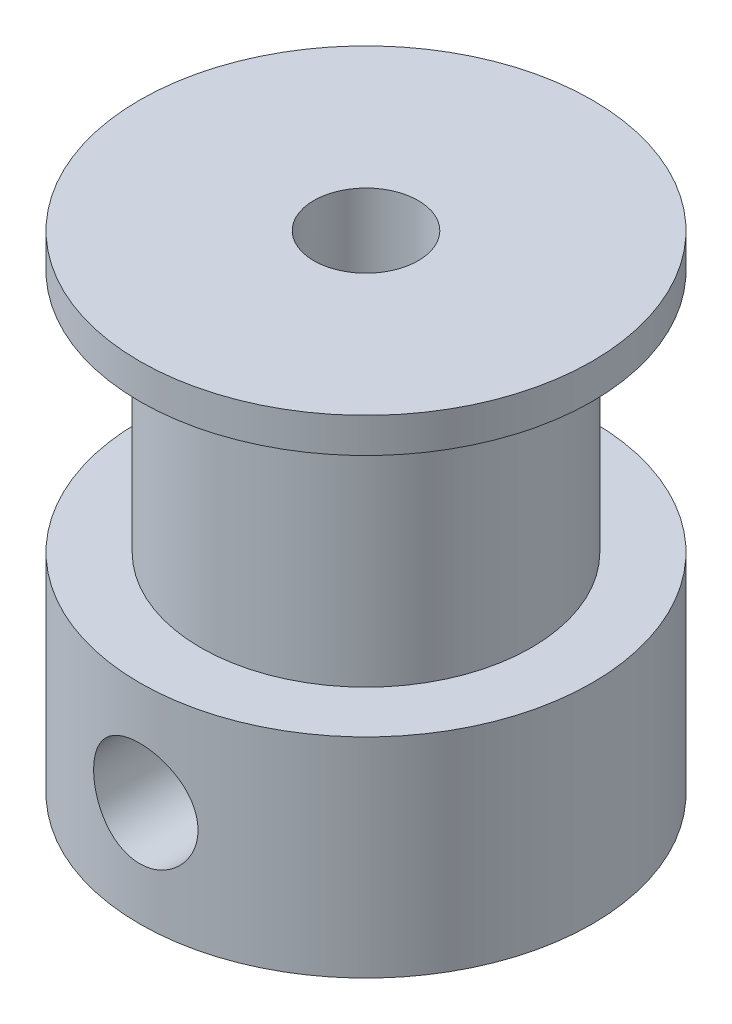
ISO-10303-21;
HEADER;
FILE_DESCRIPTION(('STEP AP214'),'2;1');
FILE_NAME('part.step','',(''),(''),'','','');
FILE_SCHEMA(('AUTOMOTIVE_DESIGN { 1 0 10303 214 1 1 1 1 }'));
ENDSEC;
DATA;
#1=APPLICATION_CONTEXT('core data for automotive mechanical design processes');
#2=APPLICATION_PROTOCOL_DEFINITION('international standard','automotive_design',2000,#1);
#3=PRODUCT_CONTEXT('',#1,'mechanical');
#4=PRODUCT('Part','Part','',(#3));
#5=PRODUCT_RELATED_PRODUCT_CATEGORY('part','',(#4));
#6=PRODUCT_DEFINITION_FORMATION('','',#4);
#7=PRODUCT_DEFINITION_CONTEXT('part definition',#1,'design');
#8=PRODUCT_DEFINITION('design','',#6,#7);
#9=PRODUCT_DEFINITION_SHAPE('','',#8);
#10=(LENGTH_UNIT() NAMED_UNIT(*) SI_UNIT(.MILLI.,.METRE.));
#11=(NAMED_UNIT(*) PLANE_ANGLE_UNIT() SI_UNIT($,.RADIAN.));
#12=(NAMED_UNIT(*) SI_UNIT($,.STERADIAN.) SOLID_ANGLE_UNIT());
#13=UNCERTAINTY_MEASURE_WITH_UNIT(LENGTH_MEASURE(1.E-05),#10,'distance_accuracy_value','');
#14=(GEOMETRIC_REPRESENTATION_CONTEXT(3) GLOBAL_UNCERTAINTY_ASSIGNED_CONTEXT((#13)) GLOBAL_UNIT_ASSIGNED_CONTEXT((#10,
#11,#12)) REPRESENTATION_CONTEXT('',''));
#15=CARTESIAN_POINT('',(0.,0.,0.));
#16=DIRECTION('',(0.,0.,1.));
#17=DIRECTION('',(1.,0.,0.));
#18=AXIS2_PLACEMENT_3D('',#15,#16,#17);
#19=CARTESIAN_POINT('',(0.,66.,0.));
#20=DIRECTION('',(0.,1.,0.));
#21=DIRECTION('',(0.,0.,1.));
#22=AXIS2_PLACEMENT_3D('',#19,#20,#21);
#23=CYLINDRICAL_SURFACE('',#22,1.5);
#24=CARTESIAN_POINT('',(0.,3.,0.));
#25=DIRECTION('',(0.,-0.707106781186547,0.707106781186547));
#26=DIRECTION('',(0.,0.707106781186547,0.707106781186547));
#27=AXIS2_PLACEMENT_3D('',#24,#25,#26);
#28=ELLIPSE('',#27,2.12132034355964,1.5);
#29=CARTESIAN_POINT('',(-1.5,3.,0.));
#30=VERTEX_POINT('',#29);
#31=CARTESIAN_POINT('',(1.5,3.,0.));
#32=VERTEX_POINT('',#31);
#33=EDGE_CURVE('E51',#30,#32,#28,.F.);
#34=ORIENTED_EDGE('',*,*,#33,.F.);
#35=CARTESIAN_POINT('',(0.,3.,0.));
#36=DIRECTION('',(0.,0.707106781186547,0.707106781186547));
#37=DIRECTION('',(0.,-0.707106781186547,0.707106781186547));
#38=AXIS2_PLACEMENT_3D('',#35,#36,#37);
#39=ELLIPSE('',#38,2.12132034355964,1.5);
#40=EDGE_CURVE('E49',#32,#30,#39,.F.);
#41=ORIENTED_EDGE('',*,*,#40,.F.);
#42=EDGE_LOOP('',(#34,#41));
#43=FACE_BOUND('',#42,.T.);
#44=CARTESIAN_POINT('',(0.,0.,0.));
#45=DIRECTION('',(0.,1.,0.));
#46=DIRECTION('',(0.,0.,1.));
#47=AXIS2_PLACEMENT_3D('',#44,#45,#46);
#48=CIRCLE('',#47,1.5);
#49=CARTESIAN_POINT('',(0.,0.,1.5));
#50=VERTEX_POINT('',#49);
#51=EDGE_CURVE('E57',#50,#50,#48,.T.);
#52=ORIENTED_EDGE('',*,*,#51,.F.);
#53=EDGE_LOOP('',(#52));
#54=FACE_BOUND('',#53,.T.);
#55=CARTESIAN_POINT('',(0.,14.,0.));
#56=DIRECTION('',(0.,1.,0.));
#57=DIRECTION('',(0.,0.,1.));
#58=AXIS2_PLACEMENT_3D('',#55,#56,#57);
#59=CIRCLE('',#58,1.5);
#60=CARTESIAN_POINT('',(0.,14.,1.5));
#61=VERTEX_POINT('',#60);
#62=EDGE_CURVE('E11',#61,#61,#59,.T.);
#63=ORIENTED_EDGE('',*,*,#62,.T.);
#64=EDGE_LOOP('',(#63));
#65=FACE_BOUND('',#64,.T.);
#66=ADVANCED_FACE('F36',(#43,#54,#65),#23,.F.);
#67=CARTESIAN_POINT('',(1.5,14.,0.));
#68=DIRECTION('',(0.,-1.,0.));
#69=DIRECTION('',(0.,0.,-1.));
#70=AXIS2_PLACEMENT_3D('',#67,#68,#69);
#71=PLANE('',#70);
#72=ORIENTED_EDGE('',*,*,#62,.F.);
#73=EDGE_LOOP('',(#72));
#74=FACE_BOUND('',#73,.T.);
#75=CARTESIAN_POINT('',(0.,14.,0.));
#76=DIRECTION('',(0.,1.,0.));
#77=DIRECTION('',(0.,0.,1.));
#78=AXIS2_PLACEMENT_3D('',#75,#76,#77);
#79=CIRCLE('',#78,6.5);
#80=CARTESIAN_POINT('',(0.,14.,6.5));
#81=VERTEX_POINT('',#80);
#82=EDGE_CURVE('E43',#81,#81,#79,.T.);
#83=ORIENTED_EDGE('',*,*,#82,.T.);
#84=EDGE_LOOP('',(#83));
#85=FACE_BOUND('',#84,.T.);
#86=ADVANCED_FACE('F97',(#74,#85),#71,.F.);
#87=CARTESIAN_POINT('',(0.,66.,0.));
#88=DIRECTION('',(0.,1.,0.));
#89=DIRECTION('',(0.,0.,1.));
#90=AXIS2_PLACEMENT_3D('',#87,#88,#89);
#91=CYLINDRICAL_SURFACE('',#90,6.5);
#92=ORIENTED_EDGE('',*,*,#82,.F.);
#93=EDGE_LOOP('',(#92));
#94=FACE_BOUND('',#93,.T.);
#95=CARTESIAN_POINT('',(0.,13.,0.));
#96=DIRECTION('',(0.,1.,0.));
#97=DIRECTION('',(0.,0.,1.));
#98=AXIS2_PLACEMENT_3D('',#95,#96,#97);
#99=CIRCLE('',#98,6.5);
#100=CARTESIAN_POINT('',(0.,13.,6.5));
#101=VERTEX_POINT('',#100);
#102=EDGE_CURVE('E108',#101,#101,#99,.T.);
#103=ORIENTED_EDGE('',*,*,#102,.T.);
#104=EDGE_LOOP('',(#103));
#105=FACE_BOUND('',#104,.T.);
#106=ADVANCED_FACE('F94',(#94,#105),#91,.T.);
#107=CARTESIAN_POINT('',(6.5,13.,0.));
#108=DIRECTION('',(0.,1.,0.));
#109=DIRECTION('',(0.,0.,1.));
#110=AXIS2_PLACEMENT_3D('',#107,#108,#109);
#111=PLANE('',#110);
#112=ORIENTED_EDGE('',*,*,#102,.F.);
#113=EDGE_LOOP('',(#112));
#114=FACE_BOUND('',#113,.T.);
#115=CARTESIAN_POINT('',(0.,13.,0.));
#116=DIRECTION('',(0.,1.,0.));
#117=DIRECTION('',(0.,0.,1.));
#118=AXIS2_PLACEMENT_3D('',#115,#116,#117);
#119=CIRCLE('',#118,4.75);
#120=CARTESIAN_POINT('',(0.,13.,4.75));
#121=VERTEX_POINT('',#120);
#122=EDGE_CURVE('E110',#121,#121,#119,.T.);
#123=ORIENTED_EDGE('',*,*,#122,.T.);
#124=EDGE_LOOP('',(#123));
#125=FACE_BOUND('',#124,.T.);
#126=ADVANCED_FACE('F90',(#114,#125),#111,.F.);
#127=CARTESIAN_POINT('',(0.,66.,0.));
#128=DIRECTION('',(0.,1.,0.));
#129=DIRECTION('',(0.,0.,1.));
#130=AXIS2_PLACEMENT_3D('',#127,#128,#129);
#131=CYLINDRICAL_SURFACE('',#130,4.75);
#132=ORIENTED_EDGE('',*,*,#122,.F.);
#133=EDGE_LOOP('',(#132));
#134=FACE_BOUND('',#133,.T.);
#135=CARTESIAN_POINT('',(0.,6.,0.));
#136=DIRECTION('',(0.,1.,0.));
#137=DIRECTION('',(0.,0.,1.));
#138=AXIS2_PLACEMENT_3D('',#135,#136,#137);
#139=CIRCLE('',#138,4.75);
#140=CARTESIAN_POINT('',(0.,6.,4.75));
#141=VERTEX_POINT('',#140);
#142=EDGE_CURVE('E115',#141,#141,#139,.T.);
#143=ORIENTED_EDGE('',*,*,#142,.T.);
#144=EDGE_LOOP('',(#143));
#145=FACE_BOUND('',#144,.T.);
#146=ADVANCED_FACE('F86',(#134,#145),#131,.T.);
#147=CARTESIAN_POINT('',(4.75,6.,0.));
#148=DIRECTION('',(0.,-1.,0.));
#149=DIRECTION('',(0.,0.,-1.));
#150=AXIS2_PLACEMENT_3D('',#147,#148,#149);
#151=PLANE('',#150);
#152=ORIENTED_EDGE('',*,*,#142,.F.);
#153=EDGE_LOOP('',(#152));
#154=FACE_BOUND('',#153,.T.);
#155=CARTESIAN_POINT('',(0.,6.,0.));
#156=DIRECTION('',(0.,1.,0.));
#157=DIRECTION('',(0.,0.,1.));
#158=AXIS2_PLACEMENT_3D('',#155,#156,#157);
#159=CIRCLE('',#158,6.5);
#160=CARTESIAN_POINT('',(0.,6.,6.5));
#161=VERTEX_POINT('',#160);
#162=EDGE_CURVE('E118',#161,#161,#159,.T.);
#163=ORIENTED_EDGE('',*,*,#162,.T.);
#164=EDGE_LOOP('',(#163));
#165=FACE_BOUND('',#164,.T.);
#166=ADVANCED_FACE('F82',(#154,#165),#151,.F.);
#167=CARTESIAN_POINT('',(0.,66.,0.));
#168=DIRECTION('',(0.,1.,0.));
#169=DIRECTION('',(0.,0.,1.));
#170=AXIS2_PLACEMENT_3D('',#167,#168,#169);
#171=CYLINDRICAL_SURFACE('',#170,6.5);
#172=CARTESIAN_POINT('',(1.5,3.,6.32455532033676));
#173=CARTESIAN_POINT('',(1.49999731225034,3.08304296481457,6.3245569864533));
#174=CARTESIAN_POINT('',(1.49308039515328,3.16611724021881,6.32620871498674));
#175=CARTESIAN_POINT('',(1.46563082834671,3.32989476208439,6.33262329615483));
#176=CARTESIAN_POINT('',(1.44508905111762,3.41059638118947,6.33738823434819));
#177=CARTESIAN_POINT('',(1.39107808122442,3.56723591928032,6.34946149326292));
#178=CARTESIAN_POINT('',(1.3576239938208,3.64317928442072,6.35676684114118));
#179=CARTESIAN_POINT('',(1.27878238190571,3.78837980344436,6.37309417235741));
#180=CARTESIAN_POINT('',(1.23339482024643,3.85763693651305,6.3821161610391));
#181=CARTESIAN_POINT('',(1.13106531351183,3.9888002271969,6.40104967504166));
#182=CARTESIAN_POINT('',(1.0739411222239,4.05056243056122,6.41097365327686));
#183=CARTESIAN_POINT('',(0.950153022384888,4.16371914455152,6.43048432059803));
#184=CARTESIAN_POINT('',(0.88348831975836,4.21511279132336,6.44007098152559));
#185=CARTESIAN_POINT('',(0.74153852579874,4.30665022045213,6.45796329743802));
#186=CARTESIAN_POINT('',(0.666161188886942,4.3466544388693,6.46625254288521));
#187=CARTESIAN_POINT('',(0.509529827009773,4.41337285008016,6.4804748675058));
#188=CARTESIAN_POINT('',(0.42827653913144,4.44008870648269,6.48640824159883));
#189=CARTESIAN_POINT('',(0.263698138287239,4.47901616389164,6.49516228038752));
#190=CARTESIAN_POINT('',(0.180433557461708,4.49147172375224,6.49803523989436));
#191=CARTESIAN_POINT('',(0.0129504286120422,4.50228889366443,6.50052632032964));
#192=CARTESIAN_POINT('',(-0.0712679971068387,4.50065229067867,6.50014485393698));
#193=CARTESIAN_POINT('',(-0.236582621768765,4.48351098366191,6.49620964643357));
#194=CARTESIAN_POINT('',(-0.317707745320443,4.46826936838369,6.49271608840583));
#195=CARTESIAN_POINT('',(-0.476216582142187,4.42477127467292,6.48301834797385));
#196=CARTESIAN_POINT('',(-0.553600114043642,4.39651416602935,6.47681403431541));
#197=CARTESIAN_POINT('',(-0.703145641253894,4.32756192487087,6.46229685303168));
#198=CARTESIAN_POINT('',(-0.775261043983783,4.28676934209995,6.45396755520295));
#199=CARTESIAN_POINT('',(-0.911717486022492,4.19397720681569,6.43611015762813));
#200=CARTESIAN_POINT('',(-0.976057353339064,4.141975968122,6.42658187760235));
#201=CARTESIAN_POINT('',(-1.09670294212735,4.02681824684636,6.40711077081721));
#202=CARTESIAN_POINT('',(-1.15278844211966,3.96343158777064,6.39716345312091));
#203=CARTESIAN_POINT('',(-1.25357772612111,3.82804876778702,6.37818005958509));
#204=CARTESIAN_POINT('',(-1.29828112665809,3.75605231692831,6.36914401445329));
#205=CARTESIAN_POINT('',(-1.37515073667099,3.60510974295587,6.35299268291512));
#206=CARTESIAN_POINT('',(-1.40727114955079,3.52613949241238,6.34588444121947));
#207=CARTESIAN_POINT('',(-1.45771632822007,3.36371822277603,6.33448805998483));
#208=CARTESIAN_POINT('',(-1.47604355932844,3.28026800726587,6.3301994165034));
#209=CARTESIAN_POINT('',(-1.49803182193799,3.11327907999829,6.3250317404996));
#210=CARTESIAN_POINT('',(-1.5020153425849,3.02978510123575,6.32407774971017));
#211=CARTESIAN_POINT('',(-1.49607984528294,2.86332596276102,6.32548450645529));
#212=CARTESIAN_POINT('',(-1.48616190022035,2.78036076273518,6.32784499818498));
#213=CARTESIAN_POINT('',(-1.45298594915779,2.61846445478047,6.33554357373051));
#214=CARTESIAN_POINT('',(-1.42990927996821,2.53949408119418,6.34084115536032));
#215=CARTESIAN_POINT('',(-1.37126901136113,2.38654121707342,6.35377976011193));
#216=CARTESIAN_POINT('',(-1.33570410783975,2.31255924842327,6.36142102796637));
#217=CARTESIAN_POINT('',(-1.25239967909704,2.17029846312045,6.3783481643039));
#218=CARTESIAN_POINT('',(-1.20446365753871,2.10213783548874,6.38765975817363));
#219=CARTESIAN_POINT('',(-1.09803158820712,1.97470963706695,6.40681231547821));
#220=CARTESIAN_POINT('',(-1.03953407290059,1.91544330424906,6.41665335234628));
#221=CARTESIAN_POINT('',(-0.912172454289643,1.80621418530046,6.43600563629776));
#222=CARTESIAN_POINT('',(-0.843116740081704,1.7564724778726,6.44550564512701));
#223=CARTESIAN_POINT('',(-0.697443174334192,1.66929459750091,6.4628898846293));
#224=CARTESIAN_POINT('',(-0.620825695362705,1.63185781868653,6.47077419484896));
#225=CARTESIAN_POINT('',(-0.462705252392962,1.57065026208146,6.48399176445978));
#226=CARTESIAN_POINT('',(-0.381239271946507,1.54678779971998,6.48934209685309));
#227=CARTESIAN_POINT('',(-0.215316112505558,1.51312348152778,6.49696306189839));
#228=CARTESIAN_POINT('',(-0.130859422765981,1.50331933666376,6.4992341959149));
#229=CARTESIAN_POINT('',(0.0365573790394641,1.49816254771714,6.50042390805381));
#230=CARTESIAN_POINT('',(0.119506994675808,1.502481302998,6.49941871891103));
#231=CARTESIAN_POINT('',(0.283464184827992,1.52470618550669,6.49433417348681));
#232=CARTESIAN_POINT('',(0.364471802184835,1.542612012715,6.49025488508533));
#233=CARTESIAN_POINT('',(0.521957811169679,1.59133798158388,6.47948846592308));
#234=CARTESIAN_POINT('',(0.598452864232128,1.62210671510091,6.47281172349154));
#235=CARTESIAN_POINT('',(0.745235906918304,1.69563668145662,6.45755951980291));
#236=CARTESIAN_POINT('',(0.815523222039263,1.73839921538093,6.448983852572));
#237=CARTESIAN_POINT('',(0.949482403657675,1.83574875604813,6.43064181454253));
#238=CARTESIAN_POINT('',(1.01298558523278,1.8905639207343,6.42085432839479));
#239=CARTESIAN_POINT('',(1.13000416077697,2.01000878854739,6.40129818016079));
#240=CARTESIAN_POINT('',(1.1835171039323,2.07464089294009,6.3915295232739));
#241=CARTESIAN_POINT('',(1.27982908304767,2.21307198064532,6.37294956195203));
#242=CARTESIAN_POINT('',(1.32245215470278,2.28699580484746,6.36415514239876));
#243=CARTESIAN_POINT('',(1.39460165995166,2.4411478416518,6.34873668426056));
#244=CARTESIAN_POINT('',(1.42413861394222,2.52137092874118,6.34211090335334));
#245=CARTESIAN_POINT('',(1.46432382845631,2.66799911893387,6.332935958069));
#246=CARTESIAN_POINT('',(1.47767548439029,2.73364086026496,6.32981507708548));
#247=CARTESIAN_POINT('',(1.49551438449417,2.86618167456254,6.32562414905362));
#248=CARTESIAN_POINT('',(1.50000216589574,2.93308067107977,6.32455397771369));
#249=CARTESIAN_POINT('',(1.5,3.,6.32455532033676));
#250=B_SPLINE_CURVE_WITH_KNOTS('',3,(#172,#173,#174,#175,#176,#177,#178,#179,#180,#181,#182,
#183,#184,#185,#186,#187,#188,#189,#190,#191,#192,#193,#194,#195,#196,#197,#198,#199,#200,#201,
#202,#203,#204,#205,#206,#207,#208,#209,#210,#211,#212,#213,#214,#215,#216,#217,#218,#219,#220,
#221,#222,#223,#224,#225,#226,#227,#228,#229,#230,#231,#232,#233,#234,#235,#236,#237,#238,#239,
#240,#241,#242,#243,#244,#245,#246,#247,#248,#249),.UNSPECIFIED.,.T.,.F.,(4,2,2,2,2,2,2,2,2,2,2,
2,2,2,2,2,2,2,2,2,2,2,2,2,2,2,2,2,2,2,2,2,2,2,2,2,2,2,4),(0.,0.248883465803498,
0.497933831393377,0.746693728125553,0.995454399233484,1.24841764299144,1.50140195363394,
1.75736456623774,2.01329512606392,2.26477865330974,2.5162302915507,2.76292232697429,
3.00962630849786,3.25829886944376,3.50700886572536,3.76147084783258,4.01594140183622,
4.27132969927229,4.52667233913447,4.77623696750947,5.02578233606488,5.27196914049443,
5.51818166102457,5.7685754392303,6.01900403679121,6.27468245443434,6.53034828108673,
6.78426611877414,7.03814260781422,7.28615450356159,7.53416092305586,7.78118549040832,
8.02823686531903,8.2804443675985,8.53271366056539,8.78883275968401,9.04474558022915,
9.24531794770394,9.44587815829012),.UNSPECIFIED.);
#251=CARTESIAN_POINT('',(1.5,3.,6.32455532033676));
#252=VERTEX_POINT('',#251);
#253=EDGE_CURVE('E54',#252,#252,#250,.T.);
#254=ORIENTED_EDGE('',*,*,#253,.F.);
#255=EDGE_LOOP('',(#254));
#256=FACE_BOUND('',#255,.T.);
#257=ORIENTED_EDGE('',*,*,#162,.F.);
#258=EDGE_LOOP('',(#257));
#259=FACE_BOUND('',#258,.T.);
#260=CARTESIAN_POINT('',(0.,0.,0.));
#261=DIRECTION('',(0.,1.,0.));
#262=DIRECTION('',(0.,0.,1.));
#263=AXIS2_PLACEMENT_3D('',#260,#261,#262);
#264=CIRCLE('',#263,6.5);
#265=CARTESIAN_POINT('',(0.,0.,6.5));
#266=VERTEX_POINT('',#265);
#267=EDGE_CURVE('E60',#266,#266,#264,.T.);
#268=ORIENTED_EDGE('',*,*,#267,.T.);
#269=EDGE_LOOP('',(#268));
#270=FACE_BOUND('',#269,.T.);
#271=ADVANCED_FACE('F78',(#256,#259,#270),#171,.T.);
#272=CARTESIAN_POINT('',(6.5,0.,0.));
#273=DIRECTION('',(0.,1.,0.));
#274=DIRECTION('',(0.,0.,1.));
#275=AXIS2_PLACEMENT_3D('',#272,#273,#274);
#276=PLANE('',#275);
#277=ORIENTED_EDGE('',*,*,#267,.F.);
#278=EDGE_LOOP('',(#277));
#279=FACE_BOUND('',#278,.T.);
#280=ORIENTED_EDGE('',*,*,#51,.T.);
#281=EDGE_LOOP('',(#280));
#282=FACE_BOUND('',#281,.T.);
#283=ADVANCED_FACE('F74',(#279,#282),#276,.F.);
#284=CARTESIAN_POINT('',(0.,3.,-6.501));
#285=DIRECTION('',(0.,0.,1.));
#286=DIRECTION('',(1.,0.,0.));
#287=AXIS2_PLACEMENT_3D('',#284,#285,#286);
#288=CYLINDRICAL_SURFACE('',#287,1.5);
#289=ORIENTED_EDGE('',*,*,#253,.T.);
#290=EDGE_LOOP('',(#289));
#291=FACE_BOUND('',#290,.T.);
#292=ORIENTED_EDGE('',*,*,#40,.T.);
#293=ORIENTED_EDGE('',*,*,#33,.T.);
#294=EDGE_LOOP('',(#292,#293));
#295=FACE_BOUND('',#294,.T.);
#296=ADVANCED_FACE('F52',(#291,#295),#288,.F.);
#297=CLOSED_SHELL('',(#66,#86,#106,#126,#146,#166,#271,#283,#296));
#298=MANIFOLD_SOLID_BREP('B2',#297);
#299=ADVANCED_BREP_SHAPE_REPRESENTATION('',(#18,#298),#14);
#300=SHAPE_DEFINITION_REPRESENTATION(#9,#299);
ENDSEC;
END-ISO-10303-21;
